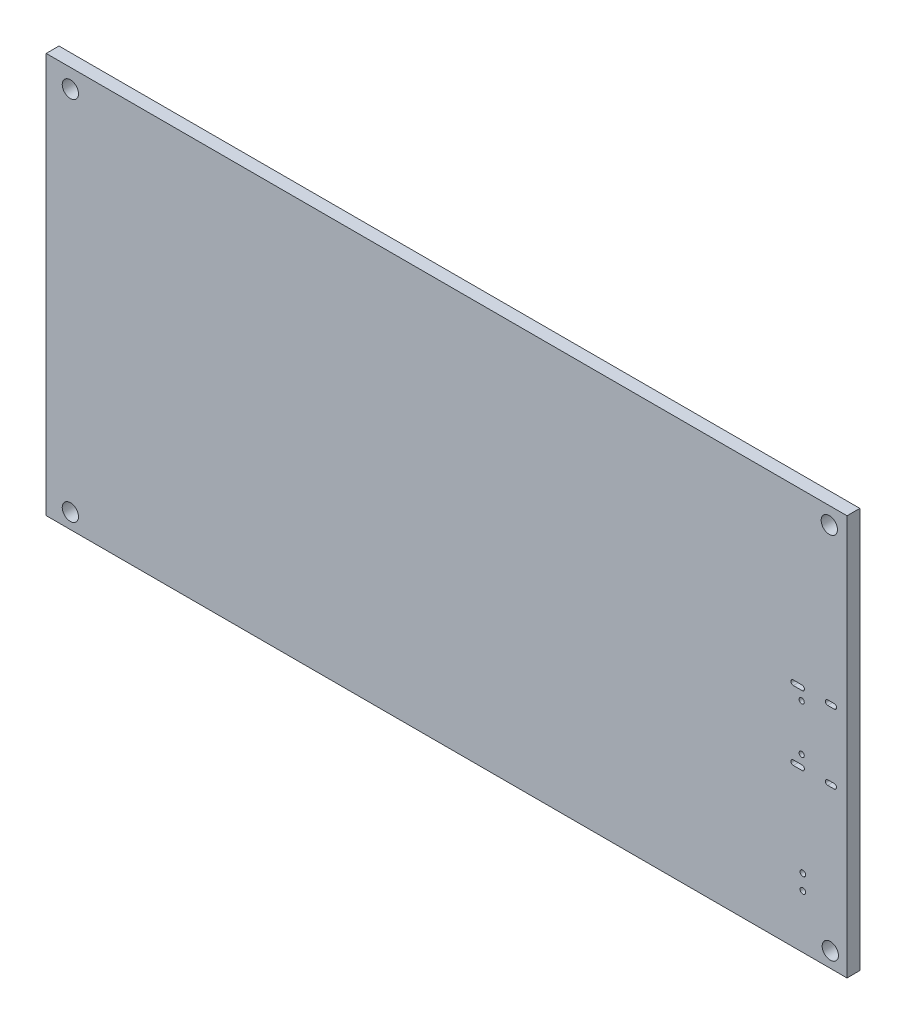
ISO-10303-21;
HEADER;
FILE_DESCRIPTION(('STEP AP214'),'2;1');
FILE_NAME('part.step','',(''),(''),'','','');
FILE_SCHEMA(('AUTOMOTIVE_DESIGN { 1 0 10303 214 1 1 1 1 }'));
ENDSEC;
DATA;
#1=APPLICATION_CONTEXT('core data for automotive mechanical design processes');
#2=APPLICATION_PROTOCOL_DEFINITION('international standard','automotive_design',2000,#1);
#3=PRODUCT_CONTEXT('',#1,'mechanical');
#4=PRODUCT('Part','Part','',(#3));
#5=PRODUCT_RELATED_PRODUCT_CATEGORY('part','',(#4));
#6=PRODUCT_DEFINITION_FORMATION('','',#4);
#7=PRODUCT_DEFINITION_CONTEXT('part definition',#1,'design');
#8=PRODUCT_DEFINITION('design','',#6,#7);
#9=PRODUCT_DEFINITION_SHAPE('','',#8);
#10=(LENGTH_UNIT() NAMED_UNIT(*) SI_UNIT(.MILLI.,.METRE.));
#11=(NAMED_UNIT(*) PLANE_ANGLE_UNIT() SI_UNIT($,.RADIAN.));
#12=(NAMED_UNIT(*) SI_UNIT($,.STERADIAN.) SOLID_ANGLE_UNIT());
#13=UNCERTAINTY_MEASURE_WITH_UNIT(LENGTH_MEASURE(1.E-05),#10,'distance_accuracy_value','');
#14=(GEOMETRIC_REPRESENTATION_CONTEXT(3) GLOBAL_UNCERTAINTY_ASSIGNED_CONTEXT((#13)) GLOBAL_UNIT_ASSIGNED_CONTEXT((#10,
#11,#12)) REPRESENTATION_CONTEXT('',''));
#15=CARTESIAN_POINT('',(0.,0.,0.));
#16=DIRECTION('',(0.,0.,1.));
#17=DIRECTION('',(1.,0.,0.));
#18=AXIS2_PLACEMENT_3D('',#15,#16,#17);
#19=CARTESIAN_POINT('',(105.378765557534,67.643053086106,0.));
#20=DIRECTION('',(0.,-1.,0.));
#21=DIRECTION('',(0.,0.,-1.00000000000004));
#22=AXIS2_PLACEMENT_3D('',#19,#20,#21);
#23=PLANE('',#22);
#24=DIRECTION('',(0.,0.,-1.00000000000004));
#25=VECTOR('',#24,1.);
#26=CARTESIAN_POINT('',(104.578765557534,67.643053086106,0.));
#27=LINE('',#26,#25);
#28=CARTESIAN_POINT('',(104.578765557534,67.643053086106,0.));
#29=VERTEX_POINT('',#28);
#30=CARTESIAN_POINT('',(104.578765557534,67.643053086106,1.60002824485604));
#31=VERTEX_POINT('',#30);
#32=EDGE_CURVE('E175',#29,#31,#27,.F.);
#33=ORIENTED_EDGE('',*,*,#32,.T.);
#34=DIRECTION('',(1.00000000000004,0.,0.));
#35=VECTOR('',#34,1.);
#36=CARTESIAN_POINT('',(105.378765557534,67.643053086106,1.60002824485604));
#37=LINE('',#36,#35);
#38=CARTESIAN_POINT('',(105.378765557534,67.643053086106,1.60002824485604));
#39=VERTEX_POINT('',#38);
#40=EDGE_CURVE('E160',#39,#31,#37,.F.);
#41=ORIENTED_EDGE('',*,*,#40,.F.);
#42=DIRECTION('',(0.,0.,-1.00000000000004));
#43=VECTOR('',#42,1.);
#44=CARTESIAN_POINT('',(105.378765557534,67.643053086106,0.));
#45=LINE('',#44,#43);
#46=CARTESIAN_POINT('',(105.378765557534,67.643053086106,0.));
#47=VERTEX_POINT('',#46);
#48=EDGE_CURVE('E199',#39,#47,#45,.T.);
#49=ORIENTED_EDGE('',*,*,#48,.T.);
#50=DIRECTION('',(1.00000000000004,0.,0.));
#51=VECTOR('',#50,1.);
#52=CARTESIAN_POINT('',(105.378765557534,67.643053086106,0.));
#53=LINE('',#52,#51);
#54=EDGE_CURVE('E172',#29,#47,#53,.T.);
#55=ORIENTED_EDGE('',*,*,#54,.F.);
#56=EDGE_LOOP('',(#33,#41,#49,#55));
#57=FACE_BOUND('',#56,.T.);
#58=ADVANCED_FACE('F17',(#57),#23,.F.);
#59=CARTESIAN_POINT('',(105.378765557535,76.283083566167,0.));
#60=DIRECTION('',(0.,-1.,0.));
#61=DIRECTION('',(0.,0.,-1.00000000000004));
#62=AXIS2_PLACEMENT_3D('',#59,#60,#61);
#63=PLANE('',#62);
#64=DIRECTION('',(0.,0.,-1.00000000000004));
#65=VECTOR('',#64,1.);
#66=CARTESIAN_POINT('',(104.578765557535,76.283083566167,0.));
#67=LINE('',#66,#65);
#68=CARTESIAN_POINT('',(104.578765557535,76.283083566167,0.));
#69=VERTEX_POINT('',#68);
#70=CARTESIAN_POINT('',(104.578765557535,76.283083566167,1.60002824485604));
#71=VERTEX_POINT('',#70);
#72=EDGE_CURVE('E194',#69,#71,#67,.F.);
#73=ORIENTED_EDGE('',*,*,#72,.T.);
#74=DIRECTION('',(1.00000000000004,0.,0.));
#75=VECTOR('',#74,1.);
#76=CARTESIAN_POINT('',(105.378765557535,76.283083566167,1.60002824485604));
#77=LINE('',#76,#75);
#78=CARTESIAN_POINT('',(105.378765557535,76.283083566167,1.60002824485604));
#79=VERTEX_POINT('',#78);
#80=EDGE_CURVE('E208',#79,#71,#77,.F.);
#81=ORIENTED_EDGE('',*,*,#80,.F.);
#82=DIRECTION('',(0.,0.,-1.00000000000004));
#83=VECTOR('',#82,1.);
#84=CARTESIAN_POINT('',(105.378765557535,76.283083566167,0.));
#85=LINE('',#84,#83);
#86=CARTESIAN_POINT('',(105.378765557535,76.283083566167,0.));
#87=VERTEX_POINT('',#86);
#88=EDGE_CURVE('E190',#79,#87,#85,.T.);
#89=ORIENTED_EDGE('',*,*,#88,.T.);
#90=DIRECTION('',(1.00000000000004,0.,0.));
#91=VECTOR('',#90,1.);
#92=CARTESIAN_POINT('',(105.378765557535,76.283083566167,0.));
#93=LINE('',#92,#91);
#94=EDGE_CURVE('E176',#69,#87,#93,.T.);
#95=ORIENTED_EDGE('',*,*,#94,.F.);
#96=EDGE_LOOP('',(#73,#81,#89,#95));
#97=FACE_BOUND('',#96,.T.);
#98=ADVANCED_FACE('F346',(#97),#63,.F.);
#99=CARTESIAN_POINT('',(104.578765557534,67.943053086106,0.));
#100=DIRECTION('',(0.,0.,-1.00000000000004));
#101=DIRECTION('',(-1.00000000000004,0.,0.));
#102=AXIS2_PLACEMENT_3D('',#99,#100,#101);
#103=CYLINDRICAL_SURFACE('',#102,0.3);
#104=DIRECTION('',(0.,0.,1.00000000000004));
#105=VECTOR('',#104,1.);
#106=CARTESIAN_POINT('',(104.578765557534,68.243053086106,0.));
#107=LINE('',#106,#105);
#108=CARTESIAN_POINT('',(104.578765557534,68.243053086106,0.));
#109=VERTEX_POINT('',#108);
#110=CARTESIAN_POINT('',(104.578765557534,68.243053086106,1.60002824485604));
#111=VERTEX_POINT('',#110);
#112=EDGE_CURVE('E179',#109,#111,#107,.T.);
#113=ORIENTED_EDGE('',*,*,#112,.T.);
#114=CARTESIAN_POINT('',(104.578765557534,67.943053086106,1.60002824485604));
#115=DIRECTION('',(0.,0.,-1.00000000000004));
#116=DIRECTION('',(-1.00000000000004,0.,0.));
#117=AXIS2_PLACEMENT_3D('',#114,#115,#116);
#118=CIRCLE('',#117,0.3);
#119=EDGE_CURVE('E166',#111,#31,#118,.F.);
#120=ORIENTED_EDGE('',*,*,#119,.T.);
#121=ORIENTED_EDGE('',*,*,#32,.F.);
#122=CARTESIAN_POINT('',(104.578765557534,67.943053086106,0.));
#123=DIRECTION('',(0.,0.,-1.00000000000004));
#124=DIRECTION('',(-1.00000000000004,0.,0.));
#125=AXIS2_PLACEMENT_3D('',#122,#123,#124);
#126=CIRCLE('',#125,0.3);
#127=EDGE_CURVE('E20',#109,#29,#126,.F.);
#128=ORIENTED_EDGE('',*,*,#127,.F.);
#129=EDGE_LOOP('',(#113,#120,#121,#128));
#130=FACE_BOUND('',#129,.T.);
#131=ADVANCED_FACE('F178',(#130),#103,.F.);
#132=CARTESIAN_POINT('',(105.378765557534,67.943053086106,0.));
#133=DIRECTION('',(0.,0.,-1.00000000000004));
#134=DIRECTION('',(-1.00000000000004,0.,0.));
#135=AXIS2_PLACEMENT_3D('',#132,#133,#134);
#136=CYLINDRICAL_SURFACE('',#135,0.3);
#137=ORIENTED_EDGE('',*,*,#48,.F.);
#138=CARTESIAN_POINT('',(105.378765557534,67.943053086106,1.60002824485604));
#139=DIRECTION('',(0.,0.,-1.00000000000004));
#140=DIRECTION('',(-1.00000000000004,0.,0.));
#141=AXIS2_PLACEMENT_3D('',#138,#139,#140);
#142=CIRCLE('',#141,0.3);
#143=CARTESIAN_POINT('',(105.378765557534,68.243053086106,1.60002824485604));
#144=VERTEX_POINT('',#143);
#145=EDGE_CURVE('E168',#39,#144,#142,.F.);
#146=ORIENTED_EDGE('',*,*,#145,.T.);
#147=DIRECTION('',(0.,0.,1.00000000000004));
#148=VECTOR('',#147,1.);
#149=CARTESIAN_POINT('',(105.378765557534,68.243053086106,0.));
#150=LINE('',#149,#148);
#151=CARTESIAN_POINT('',(105.378765557534,68.243053086106,0.));
#152=VERTEX_POINT('',#151);
#153=EDGE_CURVE('E306',#144,#152,#150,.F.);
#154=ORIENTED_EDGE('',*,*,#153,.T.);
#155=CARTESIAN_POINT('',(105.378765557534,67.943053086106,0.));
#156=DIRECTION('',(0.,0.,-1.00000000000004));
#157=DIRECTION('',(-1.00000000000004,0.,0.));
#158=AXIS2_PLACEMENT_3D('',#155,#156,#157);
#159=CIRCLE('',#158,0.3);
#160=EDGE_CURVE('E198',#47,#152,#159,.F.);
#161=ORIENTED_EDGE('',*,*,#160,.F.);
#162=EDGE_LOOP('',(#137,#146,#154,#161));
#163=FACE_BOUND('',#162,.T.);
#164=ADVANCED_FACE('F659',(#163),#136,.F.);
#165=CARTESIAN_POINT('',(100.278740157484,67.943053086106,0.));
#166=DIRECTION('',(0.,0.,-1.00000000000004));
#167=DIRECTION('',(-1.00000000000004,0.,0.));
#168=AXIS2_PLACEMENT_3D('',#165,#166,#167);
#169=CYLINDRICAL_SURFACE('',#168,0.3);
#170=DIRECTION('',(0.,0.,1.00000000000004));
#171=VECTOR('',#170,1.);
#172=CARTESIAN_POINT('',(100.278740157484,68.243053086106,0.));
#173=LINE('',#172,#171);
#174=CARTESIAN_POINT('',(100.278740157484,68.243053086106,0.));
#175=VERTEX_POINT('',#174);
#176=CARTESIAN_POINT('',(100.278740157484,68.243053086106,1.60002824485604));
#177=VERTEX_POINT('',#176);
#178=EDGE_CURVE('E286',#175,#177,#173,.T.);
#179=ORIENTED_EDGE('',*,*,#178,.T.);
#180=CARTESIAN_POINT('',(100.278740157484,67.943053086106,1.60002824485604));
#181=DIRECTION('',(0.,0.,-1.00000000000004));
#182=DIRECTION('',(-1.00000000000004,0.,0.));
#183=AXIS2_PLACEMENT_3D('',#180,#181,#182);
#184=CIRCLE('',#183,0.3);
#185=CARTESIAN_POINT('',(100.278740157484,67.643053086106,1.60002824485604));
#186=VERTEX_POINT('',#185);
#187=EDGE_CURVE('E181',#177,#186,#184,.F.);
#188=ORIENTED_EDGE('',*,*,#187,.T.);
#189=DIRECTION('',(0.,0.,-1.00000000000004));
#190=VECTOR('',#189,1.);
#191=CARTESIAN_POINT('',(100.278740157484,67.643053086106,0.));
#192=LINE('',#191,#190);
#193=CARTESIAN_POINT('',(100.278740157484,67.643053086106,0.));
#194=VERTEX_POINT('',#193);
#195=EDGE_CURVE('E283',#186,#194,#192,.T.);
#196=ORIENTED_EDGE('',*,*,#195,.T.);
#197=CARTESIAN_POINT('',(100.278740157484,67.943053086106,0.));
#198=DIRECTION('',(0.,0.,-1.00000000000004));
#199=DIRECTION('',(-1.00000000000004,0.,0.));
#200=AXIS2_PLACEMENT_3D('',#197,#198,#199);
#201=CIRCLE('',#200,0.3);
#202=EDGE_CURVE('E197',#175,#194,#201,.F.);
#203=ORIENTED_EDGE('',*,*,#202,.F.);
#204=EDGE_LOOP('',(#179,#188,#196,#203));
#205=FACE_BOUND('',#204,.T.);
#206=ADVANCED_FACE('F281',(#205),#169,.F.);
#207=CARTESIAN_POINT('',(101.378765557534,67.943053086106,0.));
#208=DIRECTION('',(0.,0.,-1.00000000000004));
#209=DIRECTION('',(-1.00000000000004,0.,0.));
#210=AXIS2_PLACEMENT_3D('',#207,#208,#209);
#211=CYLINDRICAL_SURFACE('',#210,0.3);
#212=DIRECTION('',(0.,0.,-1.00000000000004));
#213=VECTOR('',#212,1.);
#214=CARTESIAN_POINT('',(101.378765557534,67.643053086106,0.));
#215=LINE('',#214,#213);
#216=CARTESIAN_POINT('',(101.378765557534,67.643053086106,0.));
#217=VERTEX_POINT('',#216);
#218=CARTESIAN_POINT('',(101.378765557534,67.643053086106,1.60002824485604));
#219=VERTEX_POINT('',#218);
#220=EDGE_CURVE('E295',#217,#219,#215,.F.);
#221=ORIENTED_EDGE('',*,*,#220,.T.);
#222=CARTESIAN_POINT('',(101.378765557534,67.943053086106,1.60002824485604));
#223=DIRECTION('',(0.,0.,-1.00000000000004));
#224=DIRECTION('',(-1.00000000000004,0.,0.));
#225=AXIS2_PLACEMENT_3D('',#222,#223,#224);
#226=CIRCLE('',#225,0.3);
#227=CARTESIAN_POINT('',(101.378765557534,68.243053086106,1.60002824485604));
#228=VERTEX_POINT('',#227);
#229=EDGE_CURVE('E276',#219,#228,#226,.F.);
#230=ORIENTED_EDGE('',*,*,#229,.T.);
#231=DIRECTION('',(0.,0.,1.00000000000004));
#232=VECTOR('',#231,1.);
#233=CARTESIAN_POINT('',(101.378765557534,68.243053086106,0.));
#234=LINE('',#233,#232);
#235=CARTESIAN_POINT('',(101.378765557534,68.243053086106,0.));
#236=VERTEX_POINT('',#235);
#237=EDGE_CURVE('E255',#228,#236,#234,.F.);
#238=ORIENTED_EDGE('',*,*,#237,.T.);
#239=CARTESIAN_POINT('',(101.378765557534,67.943053086106,0.));
#240=DIRECTION('',(0.,0.,-1.00000000000004));
#241=DIRECTION('',(-1.00000000000004,0.,0.));
#242=AXIS2_PLACEMENT_3D('',#239,#240,#241);
#243=CIRCLE('',#242,0.3);
#244=EDGE_CURVE('E195',#217,#236,#243,.F.);
#245=ORIENTED_EDGE('',*,*,#244,.F.);
#246=EDGE_LOOP('',(#221,#230,#238,#245));
#247=FACE_BOUND('',#246,.T.);
#248=ADVANCED_FACE('F375',(#247),#211,.F.);
#249=CARTESIAN_POINT('',(104.578765557535,76.583083566167,0.));
#250=DIRECTION('',(0.,0.,-1.00000000000004));
#251=DIRECTION('',(-1.00000000000004,0.,0.));
#252=AXIS2_PLACEMENT_3D('',#249,#250,#251);
#253=CYLINDRICAL_SURFACE('',#252,0.3);
#254=DIRECTION('',(0.,0.,1.00000000000004));
#255=VECTOR('',#254,1.);
#256=CARTESIAN_POINT('',(104.578765557535,76.883083566167,0.));
#257=LINE('',#256,#255);
#258=CARTESIAN_POINT('',(104.578765557535,76.883083566167,0.));
#259=VERTEX_POINT('',#258);
#260=CARTESIAN_POINT('',(104.578765557535,76.883083566167,1.60002824485604));
#261=VERTEX_POINT('',#260);
#262=EDGE_CURVE('E248',#259,#261,#257,.T.);
#263=ORIENTED_EDGE('',*,*,#262,.T.);
#264=CARTESIAN_POINT('',(104.578765557535,76.583083566167,1.60002824485604));
#265=DIRECTION('',(0.,0.,-1.00000000000004));
#266=DIRECTION('',(-1.00000000000004,0.,0.));
#267=AXIS2_PLACEMENT_3D('',#264,#265,#266);
#268=CIRCLE('',#267,0.3);
#269=EDGE_CURVE('E273',#261,#71,#268,.F.);
#270=ORIENTED_EDGE('',*,*,#269,.T.);
#271=ORIENTED_EDGE('',*,*,#72,.F.);
#272=CARTESIAN_POINT('',(104.578765557535,76.583083566167,0.));
#273=DIRECTION('',(0.,0.,-1.00000000000004));
#274=DIRECTION('',(-1.00000000000004,0.,0.));
#275=AXIS2_PLACEMENT_3D('',#272,#273,#274);
#276=CIRCLE('',#275,0.3);
#277=EDGE_CURVE('E191',#259,#69,#276,.F.);
#278=ORIENTED_EDGE('',*,*,#277,.F.);
#279=EDGE_LOOP('',(#263,#270,#271,#278));
#280=FACE_BOUND('',#279,.T.);
#281=ADVANCED_FACE('F360',(#280),#253,.F.);
#282=CARTESIAN_POINT('',(105.378765557535,76.583083566167,0.));
#283=DIRECTION('',(0.,0.,-1.00000000000004));
#284=DIRECTION('',(-1.00000000000004,0.,0.));
#285=AXIS2_PLACEMENT_3D('',#282,#283,#284);
#286=CYLINDRICAL_SURFACE('',#285,0.3);
#287=ORIENTED_EDGE('',*,*,#88,.F.);
#288=CARTESIAN_POINT('',(105.378765557535,76.583083566167,1.60002824485604));
#289=DIRECTION('',(0.,0.,-1.00000000000004));
#290=DIRECTION('',(-1.00000000000004,0.,0.));
#291=AXIS2_PLACEMENT_3D('',#288,#289,#290);
#292=CIRCLE('',#291,0.3);
#293=CARTESIAN_POINT('',(105.378765557535,76.883083566167,1.60002824485604));
#294=VERTEX_POINT('',#293);
#295=EDGE_CURVE('E271',#79,#294,#292,.F.);
#296=ORIENTED_EDGE('',*,*,#295,.T.);
#297=DIRECTION('',(0.,0.,1.00000000000004));
#298=VECTOR('',#297,1.);
#299=CARTESIAN_POINT('',(105.378765557535,76.883083566167,0.));
#300=LINE('',#299,#298);
#301=CARTESIAN_POINT('',(105.378765557535,76.883083566167,0.));
#302=VERTEX_POINT('',#301);
#303=EDGE_CURVE('E339',#294,#302,#300,.F.);
#304=ORIENTED_EDGE('',*,*,#303,.T.);
#305=CARTESIAN_POINT('',(105.378765557535,76.583083566167,0.));
#306=DIRECTION('',(0.,0.,-1.00000000000004));
#307=DIRECTION('',(-1.00000000000004,0.,0.));
#308=AXIS2_PLACEMENT_3D('',#305,#306,#307);
#309=CIRCLE('',#308,0.3);
#310=EDGE_CURVE('E188',#87,#302,#309,.F.);
#311=ORIENTED_EDGE('',*,*,#310,.F.);
#312=EDGE_LOOP('',(#287,#296,#304,#311));
#313=FACE_BOUND('',#312,.T.);
#314=ADVANCED_FACE('F350',(#313),#286,.F.);
#315=CARTESIAN_POINT('',(100.278740157484,76.583083566167,0.));
#316=DIRECTION('',(0.,0.,-1.00000000000004));
#317=DIRECTION('',(-1.00000000000004,0.,0.));
#318=AXIS2_PLACEMENT_3D('',#315,#316,#317);
#319=CYLINDRICAL_SURFACE('',#318,0.3);
#320=DIRECTION('',(0.,0.,1.00000000000004));
#321=VECTOR('',#320,1.);
#322=CARTESIAN_POINT('',(100.278740157484,76.883083566167,0.));
#323=LINE('',#322,#321);
#324=CARTESIAN_POINT('',(100.278740157484,76.883083566167,0.));
#325=VERTEX_POINT('',#324);
#326=CARTESIAN_POINT('',(100.278740157484,76.883083566167,1.60002824485604));
#327=VERTEX_POINT('',#326);
#328=EDGE_CURVE('E330',#325,#327,#323,.T.);
#329=ORIENTED_EDGE('',*,*,#328,.T.);
#330=CARTESIAN_POINT('',(100.278740157484,76.583083566167,1.60002824485604));
#331=DIRECTION('',(0.,0.,-1.00000000000004));
#332=DIRECTION('',(-1.00000000000004,0.,0.));
#333=AXIS2_PLACEMENT_3D('',#330,#331,#332);
#334=CIRCLE('',#333,0.3);
#335=CARTESIAN_POINT('',(100.278740157484,76.283083566167,1.60002824485604));
#336=VERTEX_POINT('',#335);
#337=EDGE_CURVE('E269',#327,#336,#334,.F.);
#338=ORIENTED_EDGE('',*,*,#337,.T.);
#339=DIRECTION('',(0.,0.,-1.00000000000004));
#340=VECTOR('',#339,1.);
#341=CARTESIAN_POINT('',(100.278740157484,76.283083566167,0.));
#342=LINE('',#341,#340);
#343=CARTESIAN_POINT('',(100.278740157484,76.283083566167,0.));
#344=VERTEX_POINT('',#343);
#345=EDGE_CURVE('E334',#336,#344,#342,.T.);
#346=ORIENTED_EDGE('',*,*,#345,.T.);
#347=CARTESIAN_POINT('',(100.278740157484,76.583083566167,0.));
#348=DIRECTION('',(0.,0.,-1.00000000000004));
#349=DIRECTION('',(-1.00000000000004,0.,0.));
#350=AXIS2_PLACEMENT_3D('',#347,#348,#349);
#351=CIRCLE('',#350,0.3);
#352=EDGE_CURVE('E183',#325,#344,#351,.F.);
#353=ORIENTED_EDGE('',*,*,#352,.F.);
#354=EDGE_LOOP('',(#329,#338,#346,#353));
#355=FACE_BOUND('',#354,.T.);
#356=ADVANCED_FACE('F401',(#355),#319,.F.);
#357=CARTESIAN_POINT('',(101.378765557535,76.583083566167,0.));
#358=DIRECTION('',(0.,0.,-1.00000000000004));
#359=DIRECTION('',(-1.00000000000004,0.,0.));
#360=AXIS2_PLACEMENT_3D('',#357,#358,#359);
#361=CYLINDRICAL_SURFACE('',#360,0.3);
#362=DIRECTION('',(0.,0.,-1.00000000000004));
#363=VECTOR('',#362,1.);
#364=CARTESIAN_POINT('',(101.378765557535,76.283083566167,0.));
#365=LINE('',#364,#363);
#366=CARTESIAN_POINT('',(101.378765557535,76.283083566167,0.));
#367=VERTEX_POINT('',#366);
#368=CARTESIAN_POINT('',(101.378765557535,76.283083566167,1.60002824485604));
#369=VERTEX_POINT('',#368);
#370=EDGE_CURVE('E335',#367,#369,#365,.F.);
#371=ORIENTED_EDGE('',*,*,#370,.T.);
#372=CARTESIAN_POINT('',(101.378765557535,76.583083566167,1.60002824485604));
#373=DIRECTION('',(0.,0.,-1.00000000000004));
#374=DIRECTION('',(-1.00000000000004,0.,0.));
#375=AXIS2_PLACEMENT_3D('',#372,#373,#374);
#376=CIRCLE('',#375,0.3);
#377=CARTESIAN_POINT('',(101.378765557535,76.883083566167,1.60002824485604));
#378=VERTEX_POINT('',#377);
#379=EDGE_CURVE('E266',#369,#378,#376,.F.);
#380=ORIENTED_EDGE('',*,*,#379,.T.);
#381=DIRECTION('',(0.,0.,1.00000000000004));
#382=VECTOR('',#381,1.);
#383=CARTESIAN_POINT('',(101.378765557535,76.883083566167,0.));
#384=LINE('',#383,#382);
#385=CARTESIAN_POINT('',(101.378765557535,76.883083566167,0.));
#386=VERTEX_POINT('',#385);
#387=EDGE_CURVE('E244',#378,#386,#384,.F.);
#388=ORIENTED_EDGE('',*,*,#387,.T.);
#389=CARTESIAN_POINT('',(101.378765557535,76.583083566167,0.));
#390=DIRECTION('',(0.,0.,-1.00000000000004));
#391=DIRECTION('',(-1.00000000000004,0.,0.));
#392=AXIS2_PLACEMENT_3D('',#389,#390,#391);
#393=CIRCLE('',#392,0.3);
#394=EDGE_CURVE('E35',#367,#386,#393,.F.);
#395=ORIENTED_EDGE('',*,*,#394,.F.);
#396=EDGE_LOOP('',(#371,#380,#388,#395));
#397=FACE_BOUND('',#396,.T.);
#398=ADVANCED_FACE('F418',(#397),#361,.F.);
#399=CARTESIAN_POINT('',(56.9999872999777,73.,1.600028244856));
#400=DIRECTION('',(0.,0.,-1.00000000000004));
#401=DIRECTION('',(-1.00000000000004,0.,0.));
#402=AXIS2_PLACEMENT_3D('',#399,#400,#401);
#403=PLANE('',#402);
#404=CARTESIAN_POINT('',(10.03302006604,95.631191262383,1.600028244856));
#405=DIRECTION('',(0.,0.,1.00000000000004));
#406=DIRECTION('',(1.00000000000004,0.,0.));
#407=AXIS2_PLACEMENT_3D('',#404,#405,#406);
#408=CIRCLE('',#407,1.016002032004);
#409=CARTESIAN_POINT('',(11.049022098044,95.631191262383,1.600028244856));
#410=VERTEX_POINT('',#409);
#411=EDGE_CURVE('E237',#410,#410,#408,.F.);
#412=ORIENTED_EDGE('',*,*,#411,.T.);
#413=EDGE_LOOP('',(#412));
#414=FACE_BOUND('',#413,.T.);
#415=CARTESIAN_POINT('',(104.775209550415,95.885191770384,1.600028244856));
#416=DIRECTION('',(0.,0.,1.00000000000004));
#417=DIRECTION('',(1.00000000000004,0.,0.));
#418=AXIS2_PLACEMENT_3D('',#415,#416,#417);
#419=CIRCLE('',#418,1.016002032004);
#420=CARTESIAN_POINT('',(105.791211582419,95.885191770384,1.600028244856));
#421=VERTEX_POINT('',#420);
#422=EDGE_CURVE('E241',#421,#421,#419,.F.);
#423=ORIENTED_EDGE('',*,*,#422,.T.);
#424=EDGE_LOOP('',(#423));
#425=FACE_BOUND('',#424,.T.);
#426=ORIENTED_EDGE('',*,*,#379,.F.);
#427=DIRECTION('',(1.00000000000004,0.,0.));
#428=VECTOR('',#427,1.);
#429=CARTESIAN_POINT('',(101.378765557535,76.283083566167,1.60002824485604));
#430=LINE('',#429,#428);
#431=EDGE_CURVE('E331',#369,#336,#430,.F.);
#432=ORIENTED_EDGE('',*,*,#431,.T.);
#433=ORIENTED_EDGE('',*,*,#337,.F.);
#434=DIRECTION('',(1.00000000000004,0.,0.));
#435=VECTOR('',#434,1.);
#436=CARTESIAN_POINT('',(100.278740157484,76.883083566167,1.60002824485604));
#437=LINE('',#436,#435);
#438=EDGE_CURVE('E327',#327,#378,#437,.T.);
#439=ORIENTED_EDGE('',*,*,#438,.T.);
#440=EDGE_LOOP('',(#426,#432,#433,#439));
#441=FACE_BOUND('',#440,.T.);
#442=ORIENTED_EDGE('',*,*,#295,.F.);
#443=ORIENTED_EDGE('',*,*,#80,.T.);
#444=ORIENTED_EDGE('',*,*,#269,.F.);
#445=DIRECTION('',(1.00000000000004,0.,0.));
#446=VECTOR('',#445,1.);
#447=CARTESIAN_POINT('',(104.578765557535,76.883083566167,1.60002824485604));
#448=LINE('',#447,#446);
#449=EDGE_CURVE('E336',#261,#294,#448,.T.);
#450=ORIENTED_EDGE('',*,*,#449,.T.);
#451=EDGE_LOOP('',(#442,#443,#444,#450));
#452=FACE_BOUND('',#451,.T.);
#453=CARTESIAN_POINT('',(101.328168656335,75.153162306325,1.60002824485604));
#454=DIRECTION('',(0.,0.,1.00000000000004));
#455=DIRECTION('',(1.00000000000004,0.,0.));
#456=AXIS2_PLACEMENT_3D('',#453,#454,#455);
#457=CIRCLE('',#456,0.324993649987);
#458=CARTESIAN_POINT('',(101.653162306322,75.153162306325,1.60002824485604));
#459=VERTEX_POINT('',#458);
#460=EDGE_CURVE('E245',#459,#459,#457,.F.);
#461=ORIENTED_EDGE('',*,*,#460,.T.);
#462=EDGE_LOOP('',(#461));
#463=FACE_BOUND('',#462,.T.);
#464=CARTESIAN_POINT('',(10.03302006604,49.9110998222,1.600028244856));
#465=DIRECTION('',(0.,0.,1.00000000000004));
#466=DIRECTION('',(1.00000000000004,0.,0.));
#467=AXIS2_PLACEMENT_3D('',#464,#465,#466);
#468=CIRCLE('',#467,1.016002032004);
#469=CARTESIAN_POINT('',(11.0490220980441,49.9110998222,1.600028244856));
#470=VERTEX_POINT('',#469);
#471=EDGE_CURVE('E249',#470,#470,#468,.F.);
#472=ORIENTED_EDGE('',*,*,#471,.T.);
#473=EDGE_LOOP('',(#472));
#474=FACE_BOUND('',#473,.T.);
#475=CARTESIAN_POINT('',(101.328168656335,69.373126746254,1.60002824485604));
#476=DIRECTION('',(0.,0.,1.00000000000004));
#477=DIRECTION('',(1.00000000000004,0.,0.));
#478=AXIS2_PLACEMENT_3D('',#475,#476,#477);
#479=CIRCLE('',#478,0.324993649987);
#480=CARTESIAN_POINT('',(101.653162306322,69.373126746254,1.60002824485604));
#481=VERTEX_POINT('',#480);
#482=EDGE_CURVE('E252',#481,#481,#479,.F.);
#483=ORIENTED_EDGE('',*,*,#482,.T.);
#484=EDGE_LOOP('',(#483));
#485=FACE_BOUND('',#484,.T.);
#486=ORIENTED_EDGE('',*,*,#229,.F.);
#487=DIRECTION('',(1.00000000000004,0.,0.));
#488=VECTOR('',#487,1.);
#489=CARTESIAN_POINT('',(101.378765557534,67.643053086106,1.60002824485604));
#490=LINE('',#489,#488);
#491=EDGE_CURVE('E292',#219,#186,#490,.F.);
#492=ORIENTED_EDGE('',*,*,#491,.T.);
#493=ORIENTED_EDGE('',*,*,#187,.F.);
#494=DIRECTION('',(1.00000000000004,0.,0.));
#495=VECTOR('',#494,1.);
#496=CARTESIAN_POINT('',(100.278740157484,68.243053086106,1.60002824485604));
#497=LINE('',#496,#495);
#498=EDGE_CURVE('E301',#177,#228,#497,.T.);
#499=ORIENTED_EDGE('',*,*,#498,.T.);
#500=EDGE_LOOP('',(#486,#492,#493,#499));
#501=FACE_BOUND('',#500,.T.);
#502=ORIENTED_EDGE('',*,*,#145,.F.);
#503=ORIENTED_EDGE('',*,*,#40,.T.);
#504=ORIENTED_EDGE('',*,*,#119,.F.);
#505=DIRECTION('',(1.00000000000004,0.,0.));
#506=VECTOR('',#505,1.);
#507=CARTESIAN_POINT('',(104.578765557534,68.243053086106,1.60002824485604));
#508=LINE('',#507,#506);
#509=EDGE_CURVE('E308',#111,#144,#508,.T.);
#510=ORIENTED_EDGE('',*,*,#509,.T.);
#511=EDGE_LOOP('',(#502,#503,#504,#510));
#512=FACE_BOUND('',#511,.T.);
#513=CARTESIAN_POINT('',(101.473202946404,56.576149352299,1.600028244856));
#514=DIRECTION('',(0.,0.,1.00000000000004));
#515=DIRECTION('',(1.00000000000004,0.,0.));
#516=AXIS2_PLACEMENT_3D('',#513,#514,#515);
#517=CIRCLE('',#516,0.350012700025);
#518=CARTESIAN_POINT('',(101.823215646429,56.576149352299,1.600028244856));
#519=VERTEX_POINT('',#518);
#520=EDGE_CURVE('E256',#519,#519,#517,.F.);
#521=ORIENTED_EDGE('',*,*,#520,.T.);
#522=EDGE_LOOP('',(#521));
#523=FACE_BOUND('',#522,.T.);
#524=CARTESIAN_POINT('',(101.473202946404,54.676225552451,1.60002824485604));
#525=DIRECTION('',(0.,0.,1.00000000000004));
#526=DIRECTION('',(1.00000000000004,0.,0.));
#527=AXIS2_PLACEMENT_3D('',#524,#525,#526);
#528=CIRCLE('',#527,0.350012700025);
#529=CARTESIAN_POINT('',(101.823215646429,54.676225552451,1.60002824485604));
#530=VERTEX_POINT('',#529);
#531=EDGE_CURVE('E259',#530,#530,#528,.F.);
#532=ORIENTED_EDGE('',*,*,#531,.T.);
#533=EDGE_LOOP('',(#532));
#534=FACE_BOUND('',#533,.T.);
#535=CARTESIAN_POINT('',(104.902209804424,49.9110998222,1.600028244856));
#536=DIRECTION('',(0.,0.,1.00000000000004));
#537=DIRECTION('',(1.00000000000004,0.,0.));
#538=AXIS2_PLACEMENT_3D('',#535,#536,#537);
#539=CIRCLE('',#538,1.016002032004);
#540=CARTESIAN_POINT('',(105.918211836428,49.9110998222,1.600028244856));
#541=VERTEX_POINT('',#540);
#542=EDGE_CURVE('E262',#541,#541,#539,.F.);
#543=ORIENTED_EDGE('',*,*,#542,.T.);
#544=EDGE_LOOP('',(#543));
#545=FACE_BOUND('',#544,.T.);
#546=DIRECTION('',(1.00000000000004,0.,0.));
#547=VECTOR('',#546,1.);
#548=CARTESIAN_POINT('',(106.987249174494,48.012725425451,1.60002824485604));
#549=LINE('',#548,#547);
#550=CARTESIAN_POINT('',(106.987249174494,48.012725425451,1.60002824485604));
#551=VERTEX_POINT('',#550);
#552=CARTESIAN_POINT('',(7.01272542545102,48.012725425451,1.60002824485604));
#553=VERTEX_POINT('',#552);
#554=EDGE_CURVE('E316',#551,#553,#549,.F.);
#555=ORIENTED_EDGE('',*,*,#554,.F.);
#556=DIRECTION('',(0.,1.,0.));
#557=VECTOR('',#556,1.);
#558=CARTESIAN_POINT('',(106.987249174495,97.987274574549,1.60002824485608));
#559=LINE('',#558,#557);
#560=CARTESIAN_POINT('',(106.987249174495,97.987274574549,1.60002824485608));
#561=VERTEX_POINT('',#560);
#562=EDGE_CURVE('E321',#561,#551,#559,.F.);
#563=ORIENTED_EDGE('',*,*,#562,.F.);
#564=DIRECTION('',(1.00000000000004,0.,0.));
#565=VECTOR('',#564,1.);
#566=CARTESIAN_POINT('',(7.01272542545099,97.987274574549,1.60002824485608));
#567=LINE('',#566,#565);
#568=CARTESIAN_POINT('',(7.01272542545099,97.987274574549,1.60002824485608));
#569=VERTEX_POINT('',#568);
#570=EDGE_CURVE('E268',#569,#561,#567,.T.);
#571=ORIENTED_EDGE('',*,*,#570,.F.);
#572=DIRECTION('',(0.,-1.,0.));
#573=VECTOR('',#572,1.);
#574=CARTESIAN_POINT('',(7.01272542545102,48.012725425451,1.60002824485604));
#575=LINE('',#574,#573);
#576=EDGE_CURVE('E312',#553,#569,#575,.F.);
#577=ORIENTED_EDGE('',*,*,#576,.F.);
#578=EDGE_LOOP('',(#555,#563,#571,#577));
#579=FACE_BOUND('',#578,.T.);
#580=ADVANCED_FACE('F162',(#414,#425,#441,#452,#463,#474,#485,#501,#512,#523,#534,#545,#579),
#403,.F.);
#581=CARTESIAN_POINT('',(7.01272542545099,97.987274574549,0.));
#582=DIRECTION('',(0.,1.,0.));
#583=DIRECTION('',(0.,0.,1.00000000000004));
#584=AXIS2_PLACEMENT_3D('',#581,#582,#583);
#585=PLANE('',#584);
#586=DIRECTION('',(0.,0.,-1.00000000000004));
#587=VECTOR('',#586,1.);
#588=CARTESIAN_POINT('',(106.987249174495,97.987274574549,0.));
#589=LINE('',#588,#587);
#590=CARTESIAN_POINT('',(106.987249174495,97.987274574549,0.));
#591=VERTEX_POINT('',#590);
#592=EDGE_CURVE('E323',#591,#561,#589,.F.);
#593=ORIENTED_EDGE('',*,*,#592,.F.);
#594=DIRECTION('',(-1.00000000000004,0.,0.));
#595=VECTOR('',#594,1.);
#596=CARTESIAN_POINT('',(56.999987299977,97.987274574549,0.));
#597=LINE('',#596,#595);
#598=CARTESIAN_POINT('',(7.01272542545099,97.987274574549,0.));
#599=VERTEX_POINT('',#598);
#600=EDGE_CURVE('E240',#599,#591,#597,.F.);
#601=ORIENTED_EDGE('',*,*,#600,.F.);
#602=DIRECTION('',(0.,0.,1.00000000000004));
#603=VECTOR('',#602,1.);
#604=CARTESIAN_POINT('',(7.01272542545101,97.987274574549,0.));
#605=LINE('',#604,#603);
#606=EDGE_CURVE('E265',#569,#599,#605,.F.);
#607=ORIENTED_EDGE('',*,*,#606,.F.);
#608=ORIENTED_EDGE('',*,*,#570,.T.);
#609=EDGE_LOOP('',(#593,#601,#607,#608));
#610=FACE_BOUND('',#609,.T.);
#611=ADVANCED_FACE('F426',(#610),#585,.T.);
#612=CARTESIAN_POINT('',(106.987249174495,97.987274574549,0.));
#613=DIRECTION('',(1.00000000000004,0.,0.));
#614=DIRECTION('',(0.,0.,-1.00000000000004));
#615=AXIS2_PLACEMENT_3D('',#612,#613,#614);
#616=PLANE('',#615);
#617=DIRECTION('',(0.,0.,-1.00000000000004));
#618=VECTOR('',#617,1.);
#619=CARTESIAN_POINT('',(106.987249174494,48.012725425451,0.));
#620=LINE('',#619,#618);
#621=CARTESIAN_POINT('',(106.987249174494,48.012725425451,0.));
#622=VERTEX_POINT('',#621);
#623=EDGE_CURVE('E318',#622,#551,#620,.F.);
#624=ORIENTED_EDGE('',*,*,#623,.F.);
#625=DIRECTION('',(0.,1.,0.));
#626=VECTOR('',#625,1.);
#627=CARTESIAN_POINT('',(106.987249174495,73.,0.));
#628=LINE('',#627,#626);
#629=EDGE_CURVE('E391',#591,#622,#628,.F.);
#630=ORIENTED_EDGE('',*,*,#629,.F.);
#631=ORIENTED_EDGE('',*,*,#592,.T.);
#632=ORIENTED_EDGE('',*,*,#562,.T.);
#633=EDGE_LOOP('',(#624,#630,#631,#632));
#634=FACE_BOUND('',#633,.T.);
#635=ADVANCED_FACE('F490',(#634),#616,.T.);
#636=CARTESIAN_POINT('',(106.987249174494,48.012725425451,0.));
#637=DIRECTION('',(0.,-1.,0.));
#638=DIRECTION('',(0.,0.,-1.00000000000004));
#639=AXIS2_PLACEMENT_3D('',#636,#637,#638);
#640=PLANE('',#639);
#641=DIRECTION('',(0.,0.,1.00000000000004));
#642=VECTOR('',#641,1.);
#643=CARTESIAN_POINT('',(7.01272542545102,48.012725425451,0.));
#644=LINE('',#643,#642);
#645=CARTESIAN_POINT('',(7.01272542545102,48.012725425451,0.));
#646=VERTEX_POINT('',#645);
#647=EDGE_CURVE('E91',#646,#553,#644,.T.);
#648=ORIENTED_EDGE('',*,*,#647,.F.);
#649=DIRECTION('',(-1.00000000000004,0.,0.));
#650=VECTOR('',#649,1.);
#651=CARTESIAN_POINT('',(56.9999872999777,48.012725425451,0.));
#652=LINE('',#651,#650);
#653=EDGE_CURVE('E388',#622,#646,#652,.T.);
#654=ORIENTED_EDGE('',*,*,#653,.F.);
#655=ORIENTED_EDGE('',*,*,#623,.T.);
#656=ORIENTED_EDGE('',*,*,#554,.T.);
#657=EDGE_LOOP('',(#648,#654,#655,#656));
#658=FACE_BOUND('',#657,.T.);
#659=ADVANCED_FACE('F486',(#658),#640,.T.);
#660=CARTESIAN_POINT('',(7.01272542545102,48.012725425451,0.));
#661=DIRECTION('',(-1.00000000000004,0.,0.));
#662=DIRECTION('',(0.,-1.,0.));
#663=AXIS2_PLACEMENT_3D('',#660,#661,#662);
#664=PLANE('',#663);
#665=ORIENTED_EDGE('',*,*,#606,.T.);
#666=DIRECTION('',(0.,1.,0.));
#667=VECTOR('',#666,1.);
#668=CARTESIAN_POINT('',(7.01272542545101,73.,0.));
#669=LINE('',#668,#667);
#670=EDGE_CURVE('E236',#646,#599,#669,.T.);
#671=ORIENTED_EDGE('',*,*,#670,.F.);
#672=ORIENTED_EDGE('',*,*,#647,.T.);
#673=ORIENTED_EDGE('',*,*,#576,.T.);
#674=EDGE_LOOP('',(#665,#671,#672,#673));
#675=FACE_BOUND('',#674,.T.);
#676=ADVANCED_FACE('F482',(#675),#664,.T.);
#677=CARTESIAN_POINT('',(104.902209804424,49.9110998222,0.));
#678=DIRECTION('',(0.,0.,1.00000000000004));
#679=DIRECTION('',(1.00000000000004,0.,0.));
#680=AXIS2_PLACEMENT_3D('',#677,#678,#679);
#681=CYLINDRICAL_SURFACE('',#680,1.016002032004);
#682=CARTESIAN_POINT('',(104.902209804424,49.9110998222,0.));
#683=DIRECTION('',(0.,0.,1.00000000000004));
#684=DIRECTION('',(1.00000000000004,0.,0.));
#685=AXIS2_PLACEMENT_3D('',#682,#683,#684);
#686=CIRCLE('',#685,1.016002032004);
#687=CARTESIAN_POINT('',(105.918211836428,49.9110998222,0.));
#688=VERTEX_POINT('',#687);
#689=EDGE_CURVE('E233',#688,#688,#686,.T.);
#690=ORIENTED_EDGE('',*,*,#689,.F.);
#691=EDGE_LOOP('',(#690));
#692=FACE_BOUND('',#691,.T.);
#693=ORIENTED_EDGE('',*,*,#542,.F.);
#694=EDGE_LOOP('',(#693));
#695=FACE_BOUND('',#694,.T.);
#696=ADVANCED_FACE('F478',(#692,#695),#681,.F.);
#697=CARTESIAN_POINT('',(101.473202946404,54.676225552451,0.));
#698=DIRECTION('',(0.,0.,1.00000000000004));
#699=DIRECTION('',(1.00000000000004,0.,0.));
#700=AXIS2_PLACEMENT_3D('',#697,#698,#699);
#701=CYLINDRICAL_SURFACE('',#700,0.350012700025);
#702=CARTESIAN_POINT('',(101.473202946404,54.676225552451,0.));
#703=DIRECTION('',(0.,0.,1.00000000000004));
#704=DIRECTION('',(1.00000000000004,0.,0.));
#705=AXIS2_PLACEMENT_3D('',#702,#703,#704);
#706=CIRCLE('',#705,0.350012700025);
#707=CARTESIAN_POINT('',(101.823215646429,54.676225552451,0.));
#708=VERTEX_POINT('',#707);
#709=EDGE_CURVE('E230',#708,#708,#706,.T.);
#710=ORIENTED_EDGE('',*,*,#709,.F.);
#711=EDGE_LOOP('',(#710));
#712=FACE_BOUND('',#711,.T.);
#713=ORIENTED_EDGE('',*,*,#531,.F.);
#714=EDGE_LOOP('',(#713));
#715=FACE_BOUND('',#714,.T.);
#716=ADVANCED_FACE('F474',(#712,#715),#701,.F.);
#717=CARTESIAN_POINT('',(101.473202946404,56.576149352299,0.));
#718=DIRECTION('',(0.,0.,1.00000000000004));
#719=DIRECTION('',(1.00000000000004,0.,0.));
#720=AXIS2_PLACEMENT_3D('',#717,#718,#719);
#721=CYLINDRICAL_SURFACE('',#720,0.350012700025);
#722=CARTESIAN_POINT('',(101.473202946404,56.576149352299,0.));
#723=DIRECTION('',(0.,0.,1.00000000000004));
#724=DIRECTION('',(1.00000000000004,0.,0.));
#725=AXIS2_PLACEMENT_3D('',#722,#723,#724);
#726=CIRCLE('',#725,0.350012700025);
#727=CARTESIAN_POINT('',(101.823215646429,56.576149352299,0.));
#728=VERTEX_POINT('',#727);
#729=EDGE_CURVE('E226',#728,#728,#726,.T.);
#730=ORIENTED_EDGE('',*,*,#729,.F.);
#731=EDGE_LOOP('',(#730));
#732=FACE_BOUND('',#731,.T.);
#733=ORIENTED_EDGE('',*,*,#520,.F.);
#734=EDGE_LOOP('',(#733));
#735=FACE_BOUND('',#734,.T.);
#736=ADVANCED_FACE('F470',(#732,#735),#721,.F.);
#737=CARTESIAN_POINT('',(104.578765557534,68.243053086106,0.));
#738=DIRECTION('',(0.,1.,0.));
#739=DIRECTION('',(0.,0.,1.00000000000004));
#740=AXIS2_PLACEMENT_3D('',#737,#738,#739);
#741=PLANE('',#740);
#742=ORIENTED_EDGE('',*,*,#153,.F.);
#743=ORIENTED_EDGE('',*,*,#509,.F.);
#744=ORIENTED_EDGE('',*,*,#112,.F.);
#745=DIRECTION('',(-1.00000000000004,0.,0.));
#746=VECTOR('',#745,1.);
#747=CARTESIAN_POINT('',(56.999987299977,68.243053086106,0.));
#748=LINE('',#747,#746);
#749=EDGE_CURVE('E229',#152,#109,#748,.T.);
#750=ORIENTED_EDGE('',*,*,#749,.F.);
#751=EDGE_LOOP('',(#742,#743,#744,#750));
#752=FACE_BOUND('',#751,.T.);
#753=ADVANCED_FACE('F467',(#752),#741,.F.);
#754=CARTESIAN_POINT('',(101.378765557534,67.643053086106,0.));
#755=DIRECTION('',(0.,-1.,0.));
#756=DIRECTION('',(0.,0.,-1.00000000000004));
#757=AXIS2_PLACEMENT_3D('',#754,#755,#756);
#758=PLANE('',#757);
#759=ORIENTED_EDGE('',*,*,#195,.F.);
#760=ORIENTED_EDGE('',*,*,#491,.F.);
#761=ORIENTED_EDGE('',*,*,#220,.F.);
#762=DIRECTION('',(-1.00000000000004,0.,0.));
#763=VECTOR('',#762,1.);
#764=CARTESIAN_POINT('',(56.999987299977,67.643053086106,0.));
#765=LINE('',#764,#763);
#766=EDGE_CURVE('E299',#194,#217,#765,.F.);
#767=ORIENTED_EDGE('',*,*,#766,.F.);
#768=EDGE_LOOP('',(#759,#760,#761,#767));
#769=FACE_BOUND('',#768,.T.);
#770=ADVANCED_FACE('F297',(#769),#758,.F.);
#771=CARTESIAN_POINT('',(100.278740157484,68.243053086106,0.));
#772=DIRECTION('',(0.,1.,0.));
#773=DIRECTION('',(0.,0.,1.00000000000004));
#774=AXIS2_PLACEMENT_3D('',#771,#772,#773);
#775=PLANE('',#774);
#776=ORIENTED_EDGE('',*,*,#237,.F.);
#777=ORIENTED_EDGE('',*,*,#498,.F.);
#778=ORIENTED_EDGE('',*,*,#178,.F.);
#779=DIRECTION('',(-1.00000000000004,0.,0.));
#780=VECTOR('',#779,1.);
#781=CARTESIAN_POINT('',(56.999987299977,68.243053086106,0.));
#782=LINE('',#781,#780);
#783=EDGE_CURVE('E225',#236,#175,#782,.T.);
#784=ORIENTED_EDGE('',*,*,#783,.F.);
#785=EDGE_LOOP('',(#776,#777,#778,#784));
#786=FACE_BOUND('',#785,.T.);
#787=ADVANCED_FACE('F378',(#786),#775,.F.);
#788=CARTESIAN_POINT('',(101.328168656335,69.373126746254,0.));
#789=DIRECTION('',(0.,0.,1.00000000000004));
#790=DIRECTION('',(1.00000000000004,0.,0.));
#791=AXIS2_PLACEMENT_3D('',#788,#789,#790);
#792=CYLINDRICAL_SURFACE('',#791,0.324993649987);
#793=CARTESIAN_POINT('',(101.328168656335,69.373126746254,0.));
#794=DIRECTION('',(0.,0.,1.00000000000004));
#795=DIRECTION('',(1.00000000000004,0.,0.));
#796=AXIS2_PLACEMENT_3D('',#793,#794,#795);
#797=CIRCLE('',#796,0.324993649987);
#798=CARTESIAN_POINT('',(101.653162306322,69.373126746254,0.));
#799=VERTEX_POINT('',#798);
#800=EDGE_CURVE('E222',#799,#799,#797,.T.);
#801=ORIENTED_EDGE('',*,*,#800,.F.);
#802=EDGE_LOOP('',(#801));
#803=FACE_BOUND('',#802,.T.);
#804=ORIENTED_EDGE('',*,*,#482,.F.);
#805=EDGE_LOOP('',(#804));
#806=FACE_BOUND('',#805,.T.);
#807=ADVANCED_FACE('F458',(#803,#806),#792,.F.);
#808=CARTESIAN_POINT('',(10.03302006604,49.9110998222,0.));
#809=DIRECTION('',(0.,0.,1.00000000000004));
#810=DIRECTION('',(1.00000000000004,0.,0.));
#811=AXIS2_PLACEMENT_3D('',#808,#809,#810);
#812=CYLINDRICAL_SURFACE('',#811,1.016002032004);
#813=CARTESIAN_POINT('',(10.03302006604,49.9110998222,0.));
#814=DIRECTION('',(0.,0.,1.00000000000004));
#815=DIRECTION('',(1.00000000000004,0.,0.));
#816=AXIS2_PLACEMENT_3D('',#813,#814,#815);
#817=CIRCLE('',#816,1.016002032004);
#818=CARTESIAN_POINT('',(11.0490220980441,49.9110998222,0.));
#819=VERTEX_POINT('',#818);
#820=EDGE_CURVE('E219',#819,#819,#817,.T.);
#821=ORIENTED_EDGE('',*,*,#820,.F.);
#822=EDGE_LOOP('',(#821));
#823=FACE_BOUND('',#822,.T.);
#824=ORIENTED_EDGE('',*,*,#471,.F.);
#825=EDGE_LOOP('',(#824));
#826=FACE_BOUND('',#825,.T.);
#827=ADVANCED_FACE('F454',(#823,#826),#812,.F.);
#828=CARTESIAN_POINT('',(101.328168656335,75.153162306325,0.));
#829=DIRECTION('',(0.,0.,1.00000000000004));
#830=DIRECTION('',(1.00000000000004,0.,0.));
#831=AXIS2_PLACEMENT_3D('',#828,#829,#830);
#832=CYLINDRICAL_SURFACE('',#831,0.324993649987);
#833=CARTESIAN_POINT('',(101.328168656335,75.153162306325,0.));
#834=DIRECTION('',(0.,0.,1.00000000000004));
#835=DIRECTION('',(1.00000000000004,0.,0.));
#836=AXIS2_PLACEMENT_3D('',#833,#834,#835);
#837=CIRCLE('',#836,0.324993649987);
#838=CARTESIAN_POINT('',(101.653162306322,75.153162306325,0.));
#839=VERTEX_POINT('',#838);
#840=EDGE_CURVE('E215',#839,#839,#837,.T.);
#841=ORIENTED_EDGE('',*,*,#840,.F.);
#842=EDGE_LOOP('',(#841));
#843=FACE_BOUND('',#842,.T.);
#844=ORIENTED_EDGE('',*,*,#460,.F.);
#845=EDGE_LOOP('',(#844));
#846=FACE_BOUND('',#845,.T.);
#847=ADVANCED_FACE('F451',(#843,#846),#832,.F.);
#848=CARTESIAN_POINT('',(104.578765557535,76.883083566167,0.));
#849=DIRECTION('',(0.,1.,0.));
#850=DIRECTION('',(0.,0.,1.00000000000004));
#851=AXIS2_PLACEMENT_3D('',#848,#849,#850);
#852=PLANE('',#851);
#853=ORIENTED_EDGE('',*,*,#303,.F.);
#854=ORIENTED_EDGE('',*,*,#449,.F.);
#855=ORIENTED_EDGE('',*,*,#262,.F.);
#856=DIRECTION('',(-1.00000000000004,0.,0.));
#857=VECTOR('',#856,1.);
#858=CARTESIAN_POINT('',(56.9999872999777,76.883083566167,0.));
#859=LINE('',#858,#857);
#860=EDGE_CURVE('E218',#302,#259,#859,.T.);
#861=ORIENTED_EDGE('',*,*,#860,.F.);
#862=EDGE_LOOP('',(#853,#854,#855,#861));
#863=FACE_BOUND('',#862,.T.);
#864=ADVANCED_FACE('F366',(#863),#852,.F.);
#865=CARTESIAN_POINT('',(101.378765557535,76.283083566167,0.));
#866=DIRECTION('',(0.,-1.,0.));
#867=DIRECTION('',(0.,0.,-1.00000000000004));
#868=AXIS2_PLACEMENT_3D('',#865,#866,#867);
#869=PLANE('',#868);
#870=ORIENTED_EDGE('',*,*,#345,.F.);
#871=ORIENTED_EDGE('',*,*,#431,.F.);
#872=ORIENTED_EDGE('',*,*,#370,.F.);
#873=DIRECTION('',(-1.00000000000004,0.,0.));
#874=VECTOR('',#873,1.);
#875=CARTESIAN_POINT('',(56.9999872999777,76.283083566167,0.));
#876=LINE('',#875,#874);
#877=EDGE_CURVE('E407',#344,#367,#876,.F.);
#878=ORIENTED_EDGE('',*,*,#877,.F.);
#879=EDGE_LOOP('',(#870,#871,#872,#878));
#880=FACE_BOUND('',#879,.T.);
#881=ADVANCED_FACE('F408',(#880),#869,.F.);
#882=CARTESIAN_POINT('',(100.278740157484,76.883083566167,0.));
#883=DIRECTION('',(0.,1.,0.));
#884=DIRECTION('',(0.,0.,1.00000000000004));
#885=AXIS2_PLACEMENT_3D('',#882,#883,#884);
#886=PLANE('',#885);
#887=ORIENTED_EDGE('',*,*,#387,.F.);
#888=ORIENTED_EDGE('',*,*,#438,.F.);
#889=ORIENTED_EDGE('',*,*,#328,.F.);
#890=DIRECTION('',(-1.00000000000004,0.,0.));
#891=VECTOR('',#890,1.);
#892=CARTESIAN_POINT('',(56.9999872999777,76.883083566167,0.));
#893=LINE('',#892,#891);
#894=EDGE_CURVE('E214',#386,#325,#893,.T.);
#895=ORIENTED_EDGE('',*,*,#894,.F.);
#896=EDGE_LOOP('',(#887,#888,#889,#895));
#897=FACE_BOUND('',#896,.T.);
#898=ADVANCED_FACE('F413',(#897),#886,.F.);
#899=CARTESIAN_POINT('',(104.775209550415,95.885191770384,0.));
#900=DIRECTION('',(0.,0.,1.00000000000004));
#901=DIRECTION('',(1.00000000000004,0.,0.));
#902=AXIS2_PLACEMENT_3D('',#899,#900,#901);
#903=CYLINDRICAL_SURFACE('',#902,1.016002032004);
#904=CARTESIAN_POINT('',(104.775209550415,95.885191770384,0.));
#905=DIRECTION('',(0.,0.,1.00000000000004));
#906=DIRECTION('',(1.00000000000004,0.,0.));
#907=AXIS2_PLACEMENT_3D('',#904,#905,#906);
#908=CIRCLE('',#907,1.016002032004);
#909=CARTESIAN_POINT('',(105.791211582419,95.885191770384,0.));
#910=VERTEX_POINT('',#909);
#911=EDGE_CURVE('E26',#910,#910,#908,.T.);
#912=ORIENTED_EDGE('',*,*,#911,.F.);
#913=EDGE_LOOP('',(#912));
#914=FACE_BOUND('',#913,.T.);
#915=ORIENTED_EDGE('',*,*,#422,.F.);
#916=EDGE_LOOP('',(#915));
#917=FACE_BOUND('',#916,.T.);
#918=ADVANCED_FACE('F437',(#914,#917),#903,.F.);
#919=CARTESIAN_POINT('',(10.03302006604,95.631191262383,0.));
#920=DIRECTION('',(0.,0.,1.00000000000004));
#921=DIRECTION('',(1.00000000000004,0.,0.));
#922=AXIS2_PLACEMENT_3D('',#919,#920,#921);
#923=CYLINDRICAL_SURFACE('',#922,1.016002032004);
#924=CARTESIAN_POINT('',(10.03302006604,95.631191262383,0.));
#925=DIRECTION('',(0.,0.,1.00000000000004));
#926=DIRECTION('',(1.00000000000004,0.,0.));
#927=AXIS2_PLACEMENT_3D('',#924,#925,#926);
#928=CIRCLE('',#927,1.016002032004);
#929=CARTESIAN_POINT('',(11.049022098044,95.631191262383,0.));
#930=VERTEX_POINT('',#929);
#931=EDGE_CURVE('E11',#930,#930,#928,.T.);
#932=ORIENTED_EDGE('',*,*,#931,.F.);
#933=EDGE_LOOP('',(#932));
#934=FACE_BOUND('',#933,.T.);
#935=ORIENTED_EDGE('',*,*,#411,.F.);
#936=EDGE_LOOP('',(#935));
#937=FACE_BOUND('',#936,.T.);
#938=ADVANCED_FACE('F431',(#934,#937),#923,.F.);
#939=CARTESIAN_POINT('',(56.9999872999777,73.,0.));
#940=DIRECTION('',(0.,0.,-1.00000000000004));
#941=DIRECTION('',(-1.00000000000004,0.,0.));
#942=AXIS2_PLACEMENT_3D('',#939,#940,#941);
#943=PLANE('',#942);
#944=ORIENTED_EDGE('',*,*,#931,.T.);
#945=EDGE_LOOP('',(#944));
#946=FACE_BOUND('',#945,.T.);
#947=ORIENTED_EDGE('',*,*,#911,.T.);
#948=EDGE_LOOP('',(#947));
#949=FACE_BOUND('',#948,.T.);
#950=ORIENTED_EDGE('',*,*,#394,.T.);
#951=ORIENTED_EDGE('',*,*,#894,.T.);
#952=ORIENTED_EDGE('',*,*,#352,.T.);
#953=ORIENTED_EDGE('',*,*,#877,.T.);
#954=EDGE_LOOP('',(#950,#951,#952,#953));
#955=FACE_BOUND('',#954,.T.);
#956=ORIENTED_EDGE('',*,*,#310,.T.);
#957=ORIENTED_EDGE('',*,*,#860,.T.);
#958=ORIENTED_EDGE('',*,*,#277,.T.);
#959=ORIENTED_EDGE('',*,*,#94,.T.);
#960=EDGE_LOOP('',(#956,#957,#958,#959));
#961=FACE_BOUND('',#960,.T.);
#962=ORIENTED_EDGE('',*,*,#840,.T.);
#963=EDGE_LOOP('',(#962));
#964=FACE_BOUND('',#963,.T.);
#965=ORIENTED_EDGE('',*,*,#820,.T.);
#966=EDGE_LOOP('',(#965));
#967=FACE_BOUND('',#966,.T.);
#968=ORIENTED_EDGE('',*,*,#800,.T.);
#969=EDGE_LOOP('',(#968));
#970=FACE_BOUND('',#969,.T.);
#971=ORIENTED_EDGE('',*,*,#244,.T.);
#972=ORIENTED_EDGE('',*,*,#783,.T.);
#973=ORIENTED_EDGE('',*,*,#202,.T.);
#974=ORIENTED_EDGE('',*,*,#766,.T.);
#975=EDGE_LOOP('',(#971,#972,#973,#974));
#976=FACE_BOUND('',#975,.T.);
#977=ORIENTED_EDGE('',*,*,#160,.T.);
#978=ORIENTED_EDGE('',*,*,#749,.T.);
#979=ORIENTED_EDGE('',*,*,#127,.T.);
#980=ORIENTED_EDGE('',*,*,#54,.T.);
#981=EDGE_LOOP('',(#977,#978,#979,#980));
#982=FACE_BOUND('',#981,.T.);
#983=ORIENTED_EDGE('',*,*,#729,.T.);
#984=EDGE_LOOP('',(#983));
#985=FACE_BOUND('',#984,.T.);
#986=ORIENTED_EDGE('',*,*,#709,.T.);
#987=EDGE_LOOP('',(#986));
#988=FACE_BOUND('',#987,.T.);
#989=ORIENTED_EDGE('',*,*,#689,.T.);
#990=EDGE_LOOP('',(#989));
#991=FACE_BOUND('',#990,.T.);
#992=ORIENTED_EDGE('',*,*,#653,.T.);
#993=ORIENTED_EDGE('',*,*,#670,.T.);
#994=ORIENTED_EDGE('',*,*,#600,.T.);
#995=ORIENTED_EDGE('',*,*,#629,.T.);
#996=EDGE_LOOP('',(#992,#993,#994,#995));
#997=FACE_BOUND('',#996,.T.);
#998=ADVANCED_FACE('F355',(#946,#949,#955,#961,#964,#967,#970,#976,#982,#985,#988,#991,#997),
#943,.T.);
#999=CLOSED_SHELL('',(#58,#98,#131,#164,#206,#248,#281,#314,#356,#398,#580,#611,#635,#659,#676,
#696,#716,#736,#753,#770,#787,#807,#827,#847,#864,#881,#898,#918,#938,#998));
#1000=MANIFOLD_SOLID_BREP('B1',#999);
#1001=ADVANCED_BREP_SHAPE_REPRESENTATION('',(#18,#1000),#14);
#1002=SHAPE_DEFINITION_REPRESENTATION(#9,#1001);
ENDSEC;
END-ISO-10303-21;
